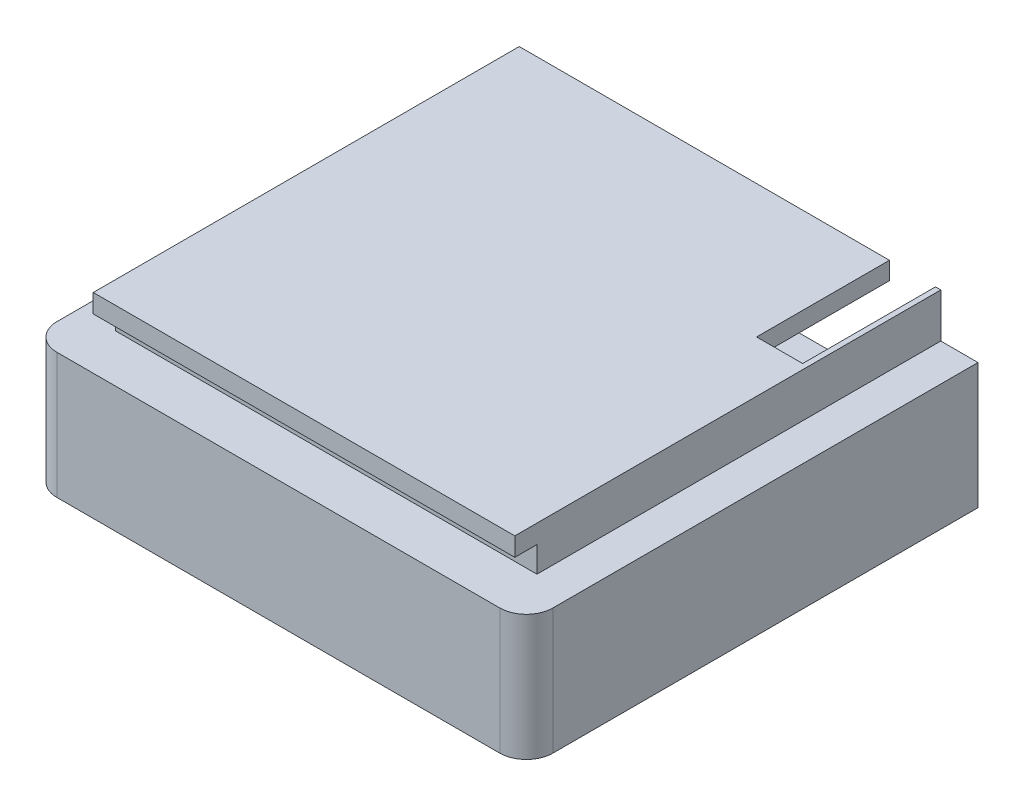
ISO-10303-21;
HEADER;
FILE_DESCRIPTION(('STEP AP214'),'2;1');
FILE_NAME('part.step','',(''),(''),'','','');
FILE_SCHEMA(('AUTOMOTIVE_DESIGN { 1 0 10303 214 1 1 1 1 }'));
ENDSEC;
DATA;
#1=APPLICATION_CONTEXT('core data for automotive mechanical design processes');
#2=APPLICATION_PROTOCOL_DEFINITION('international standard','automotive_design',2000,#1);
#3=PRODUCT_CONTEXT('',#1,'mechanical');
#4=PRODUCT('Part','Part','',(#3));
#5=PRODUCT_RELATED_PRODUCT_CATEGORY('part','',(#4));
#6=PRODUCT_DEFINITION_FORMATION('','',#4);
#7=PRODUCT_DEFINITION_CONTEXT('part definition',#1,'design');
#8=PRODUCT_DEFINITION('design','',#6,#7);
#9=PRODUCT_DEFINITION_SHAPE('','',#8);
#10=(LENGTH_UNIT() NAMED_UNIT(*) SI_UNIT(.MILLI.,.METRE.));
#11=(NAMED_UNIT(*) PLANE_ANGLE_UNIT() SI_UNIT($,.RADIAN.));
#12=(NAMED_UNIT(*) SI_UNIT($,.STERADIAN.) SOLID_ANGLE_UNIT());
#13=UNCERTAINTY_MEASURE_WITH_UNIT(LENGTH_MEASURE(1.E-05),#10,'distance_accuracy_value','');
#14=(GEOMETRIC_REPRESENTATION_CONTEXT(3) GLOBAL_UNCERTAINTY_ASSIGNED_CONTEXT((#13)) GLOBAL_UNIT_ASSIGNED_CONTEXT((#10,
#11,#12)) REPRESENTATION_CONTEXT('',''));
#15=CARTESIAN_POINT('',(0.,0.,0.));
#16=DIRECTION('',(0.,0.,1.));
#17=DIRECTION('',(1.,0.,0.));
#18=AXIS2_PLACEMENT_3D('',#15,#16,#17);
#19=CARTESIAN_POINT('',(0.,10.2,-51.));
#20=DIRECTION('',(0.,0.,1.));
#21=DIRECTION('',(1.,0.,0.));
#22=AXIS2_PLACEMENT_3D('',#19,#20,#21);
#23=PLANE('',#22);
#24=DIRECTION('',(1.,0.,0.));
#25=VECTOR('',#24,1.);
#26=CARTESIAN_POINT('',(56.,-7.,-51.));
#27=LINE('',#26,#25);
#28=CARTESIAN_POINT('',(51.2,-7.,-51.));
#29=VERTEX_POINT('',#28);
#30=CARTESIAN_POINT('',(56.,-7.,-51.));
#31=VERTEX_POINT('',#30);
#32=EDGE_CURVE('E260',#29,#31,#27,.T.);
#33=ORIENTED_EDGE('',*,*,#32,.F.);
#34=DIRECTION('',(0.,-1.,0.));
#35=VECTOR('',#34,1.);
#36=CARTESIAN_POINT('',(51.2,10.2,-51.));
#37=LINE('',#36,#35);
#38=CARTESIAN_POINT('',(51.2,12.2,-51.));
#39=VERTEX_POINT('',#38);
#40=EDGE_CURVE('E295',#39,#29,#37,.T.);
#41=ORIENTED_EDGE('',*,*,#40,.F.);
#42=DIRECTION('',(-1.,0.,0.));
#43=VECTOR('',#42,1.);
#44=CARTESIAN_POINT('',(0.,12.2,-51.));
#45=LINE('',#44,#43);
#46=CARTESIAN_POINT('',(51.8,12.2,-51.));
#47=VERTEX_POINT('',#46);
#48=EDGE_CURVE('E315',#47,#39,#45,.T.);
#49=ORIENTED_EDGE('',*,*,#48,.F.);
#50=DIRECTION('',(0.,1.,0.));
#51=VECTOR('',#50,1.);
#52=CARTESIAN_POINT('',(51.8,-43.9566222497146,-51.));
#53=LINE('',#52,#51);
#54=CARTESIAN_POINT('',(51.8,7.2,-51.));
#55=VERTEX_POINT('',#54);
#56=EDGE_CURVE('E379',#55,#47,#53,.T.);
#57=ORIENTED_EDGE('',*,*,#56,.F.);
#58=DIRECTION('',(-1.,0.,0.));
#59=VECTOR('',#58,1.);
#60=CARTESIAN_POINT('',(52.,7.2,-51.));
#61=LINE('',#60,#59);
#62=CARTESIAN_POINT('',(56.,7.2,-51.));
#63=VERTEX_POINT('',#62);
#64=EDGE_CURVE('E375',#63,#55,#61,.T.);
#65=ORIENTED_EDGE('',*,*,#64,.F.);
#66=DIRECTION('',(0.,-1.,0.));
#67=VECTOR('',#66,1.);
#68=CARTESIAN_POINT('',(56.,10.2,-51.));
#69=LINE('',#68,#67);
#70=EDGE_CURVE('E243',#63,#31,#69,.T.);
#71=ORIENTED_EDGE('',*,*,#70,.T.);
#72=EDGE_LOOP('',(#33,#41,#49,#57,#65,#71));
#73=FACE_BOUND('',#72,.T.);
#74=ADVANCED_FACE('F43',(#73),#23,.F.);
#75=CARTESIAN_POINT('',(46.,12.2,-51.));
#76=VERTEX_POINT('',#75);
#77=CARTESIAN_POINT('',(4.2,12.2,-51.));
#78=VERTEX_POINT('',#77);
#79=EDGE_CURVE('E393',#76,#78,#45,.T.);
#80=ORIENTED_EDGE('',*,*,#79,.F.);
#81=DIRECTION('',(0.,1.,0.));
#82=VECTOR('',#81,1.);
#83=CARTESIAN_POINT('',(46.,12.2,-51.));
#84=LINE('',#83,#82);
#85=CARTESIAN_POINT('',(46.,10.2,-51.));
#86=VERTEX_POINT('',#85);
#87=EDGE_CURVE('E565',#86,#76,#84,.T.);
#88=ORIENTED_EDGE('',*,*,#87,.F.);
#89=DIRECTION('',(-1.,0.,0.));
#90=VECTOR('',#89,1.);
#91=CARTESIAN_POINT('',(0.,10.2,-51.));
#92=LINE('',#91,#90);
#93=CARTESIAN_POINT('',(4.8,10.2,-51.));
#94=VERTEX_POINT('',#93);
#95=EDGE_CURVE('E394',#86,#94,#92,.T.);
#96=ORIENTED_EDGE('',*,*,#95,.T.);
#97=DIRECTION('',(0.,-1.,0.));
#98=VECTOR('',#97,1.);
#99=CARTESIAN_POINT('',(4.8,10.2,-51.));
#100=LINE('',#99,#98);
#101=CARTESIAN_POINT('',(4.8,-7.,-51.));
#102=VERTEX_POINT('',#101);
#103=EDGE_CURVE('E277',#94,#102,#100,.T.);
#104=ORIENTED_EDGE('',*,*,#103,.T.);
#105=DIRECTION('',(1.,0.,0.));
#106=VECTOR('',#105,1.);
#107=CARTESIAN_POINT('',(0.,-7.,-51.));
#108=LINE('',#107,#106);
#109=CARTESIAN_POINT('',(0.,-7.,-51.));
#110=VERTEX_POINT('',#109);
#111=EDGE_CURVE('E225',#110,#102,#108,.T.);
#112=ORIENTED_EDGE('',*,*,#111,.F.);
#113=DIRECTION('',(0.,-1.,0.));
#114=VECTOR('',#113,1.);
#115=CARTESIAN_POINT('',(0.,10.2,-51.));
#116=LINE('',#115,#114);
#117=CARTESIAN_POINT('',(0.,7.2,-51.));
#118=VERTEX_POINT('',#117);
#119=EDGE_CURVE('E282',#118,#110,#116,.T.);
#120=ORIENTED_EDGE('',*,*,#119,.F.);
#121=DIRECTION('',(-1.,0.,0.));
#122=VECTOR('',#121,1.);
#123=CARTESIAN_POINT('',(0.,7.2,-51.));
#124=LINE('',#123,#122);
#125=CARTESIAN_POINT('',(4.2,7.2,-51.));
#126=VERTEX_POINT('',#125);
#127=EDGE_CURVE('E370',#126,#118,#124,.T.);
#128=ORIENTED_EDGE('',*,*,#127,.F.);
#129=DIRECTION('',(0.,1.,0.));
#130=VECTOR('',#129,1.);
#131=CARTESIAN_POINT('',(4.2,10.2,-51.));
#132=LINE('',#131,#130);
#133=EDGE_CURVE('E374',#126,#78,#132,.T.);
#134=ORIENTED_EDGE('',*,*,#133,.T.);
#135=EDGE_LOOP('',(#80,#88,#96,#104,#112,#120,#128,#134));
#136=FACE_BOUND('',#135,.T.);
#137=ADVANCED_FACE('F516',(#136),#23,.F.);
#138=CARTESIAN_POINT('',(0.,-1.6,-107.035702904488));
#139=DIRECTION('',(0.,-1.,0.));
#140=DIRECTION('',(0.,0.,-1.));
#141=AXIS2_PLACEMENT_3D('',#138,#139,#140);
#142=PLANE('',#141);
#143=DIRECTION('',(0.,0.,-1.));
#144=VECTOR('',#143,1.);
#145=CARTESIAN_POINT('',(46.,-1.6,-107.035702904488));
#146=LINE('',#145,#144);
#147=CARTESIAN_POINT('',(46.,-1.6,-36.));
#148=VERTEX_POINT('',#147);
#149=CARTESIAN_POINT('',(46.,-1.6,-51.));
#150=VERTEX_POINT('',#149);
#151=EDGE_CURVE('E323',#148,#150,#146,.T.);
#152=ORIENTED_EDGE('',*,*,#151,.F.);
#153=DIRECTION('',(-1.,0.,0.));
#154=VECTOR('',#153,1.);
#155=CARTESIAN_POINT('',(0.,-1.6,-36.));
#156=LINE('',#155,#154);
#157=CARTESIAN_POINT('',(51.2,-1.6,-36.));
#158=VERTEX_POINT('',#157);
#159=EDGE_CURVE('E305',#158,#148,#156,.T.);
#160=ORIENTED_EDGE('',*,*,#159,.F.);
#161=DIRECTION('',(0.,0.,-1.));
#162=VECTOR('',#161,1.);
#163=CARTESIAN_POINT('',(51.2,-1.6,-6.99999999999998));
#164=LINE('',#163,#162);
#165=CARTESIAN_POINT('',(51.2,-1.6,-2.3));
#166=VERTEX_POINT('',#165);
#167=EDGE_CURVE('E255',#166,#158,#164,.T.);
#168=ORIENTED_EDGE('',*,*,#167,.F.);
#169=DIRECTION('',(1.,0.,0.));
#170=VECTOR('',#169,1.);
#171=CARTESIAN_POINT('',(0.,-1.6,-2.3));
#172=LINE('',#171,#170);
#173=CARTESIAN_POINT('',(4.8,-1.6,-2.3));
#174=VERTEX_POINT('',#173);
#175=EDGE_CURVE('E218',#174,#166,#172,.T.);
#176=ORIENTED_EDGE('',*,*,#175,.F.);
#177=DIRECTION('',(0.,0.,1.));
#178=VECTOR('',#177,1.);
#179=CARTESIAN_POINT('',(4.8,-1.6,-51.));
#180=LINE('',#179,#178);
#181=CARTESIAN_POINT('',(4.8,-1.6,-36.));
#182=VERTEX_POINT('',#181);
#183=EDGE_CURVE('E207',#182,#174,#180,.T.);
#184=ORIENTED_EDGE('',*,*,#183,.F.);
#185=DIRECTION('',(1.,0.,0.));
#186=VECTOR('',#185,1.);
#187=CARTESIAN_POINT('',(0.,-1.6,-36.));
#188=LINE('',#187,#186);
#189=CARTESIAN_POINT('',(10.,-1.6,-36.));
#190=VERTEX_POINT('',#189);
#191=EDGE_CURVE('E191',#182,#190,#188,.T.);
#192=ORIENTED_EDGE('',*,*,#191,.T.);
#193=DIRECTION('',(0.,0.,1.));
#194=VECTOR('',#193,1.);
#195=CARTESIAN_POINT('',(10.,-1.6,-107.035702904488));
#196=LINE('',#195,#194);
#197=CARTESIAN_POINT('',(10.,-1.6,-51.));
#198=VERTEX_POINT('',#197);
#199=EDGE_CURVE('E202',#198,#190,#196,.T.);
#200=ORIENTED_EDGE('',*,*,#199,.F.);
#201=DIRECTION('',(-1.,0.,0.));
#202=VECTOR('',#201,1.);
#203=CARTESIAN_POINT('',(0.,-1.6,-51.));
#204=LINE('',#203,#202);
#205=EDGE_CURVE('E327',#150,#198,#204,.T.);
#206=ORIENTED_EDGE('',*,*,#205,.F.);
#207=EDGE_LOOP('',(#152,#160,#168,#176,#184,#192,#200,#206));
#208=FACE_BOUND('',#207,.T.);
#209=ADVANCED_FACE('F45',(#208),#142,.T.);
#210=CARTESIAN_POINT('',(0.,0.,-2.3));
#211=DIRECTION('',(0.,0.,1.));
#212=DIRECTION('',(1.,0.,0.));
#213=AXIS2_PLACEMENT_3D('',#210,#211,#212);
#214=PLANE('',#213);
#215=DIRECTION('',(0.,1.,0.));
#216=VECTOR('',#215,1.);
#217=CARTESIAN_POINT('',(51.2,0.,-2.3));
#218=LINE('',#217,#216);
#219=CARTESIAN_POINT('',(51.2,-4.7,-2.3));
#220=VERTEX_POINT('',#219);
#221=EDGE_CURVE('E252',#220,#166,#218,.T.);
#222=ORIENTED_EDGE('',*,*,#221,.F.);
#223=DIRECTION('',(1.,0.,0.));
#224=VECTOR('',#223,1.);
#225=CARTESIAN_POINT('',(0.,-4.7,-2.3));
#226=LINE('',#225,#224);
#227=CARTESIAN_POINT('',(4.8,-4.7,-2.3));
#228=VERTEX_POINT('',#227);
#229=EDGE_CURVE('E261',#228,#220,#226,.T.);
#230=ORIENTED_EDGE('',*,*,#229,.F.);
#231=DIRECTION('',(0.,1.,0.));
#232=VECTOR('',#231,1.);
#233=CARTESIAN_POINT('',(4.8,10.2,-2.3));
#234=LINE('',#233,#232);
#235=EDGE_CURVE('E220',#228,#174,#234,.T.);
#236=ORIENTED_EDGE('',*,*,#235,.T.);
#237=ORIENTED_EDGE('',*,*,#175,.T.);
#238=EDGE_LOOP('',(#222,#230,#236,#237));
#239=FACE_BOUND('',#238,.T.);
#240=ADVANCED_FACE('F663',(#239),#214,.F.);
#241=CARTESIAN_POINT('',(0.,-4.7,-5.));
#242=DIRECTION('',(0.,-1.,0.));
#243=DIRECTION('',(0.,0.,-1.));
#244=AXIS2_PLACEMENT_3D('',#241,#242,#243);
#245=PLANE('',#244);
#246=DIRECTION('',(0.,0.,1.));
#247=VECTOR('',#246,1.);
#248=CARTESIAN_POINT('',(51.2,-4.7,-5.));
#249=LINE('',#248,#247);
#250=CARTESIAN_POINT('',(51.2,-4.7,-4.8));
#251=VERTEX_POINT('',#250);
#252=EDGE_CURVE('E221',#251,#220,#249,.T.);
#253=ORIENTED_EDGE('',*,*,#252,.F.);
#254=DIRECTION('',(1.,0.,0.));
#255=VECTOR('',#254,1.);
#256=CARTESIAN_POINT('',(0.,-4.7,-4.8));
#257=LINE('',#256,#255);
#258=CARTESIAN_POINT('',(4.8,-4.7,-4.8));
#259=VERTEX_POINT('',#258);
#260=EDGE_CURVE('E247',#259,#251,#257,.T.);
#261=ORIENTED_EDGE('',*,*,#260,.F.);
#262=DIRECTION('',(0.,0.,-1.));
#263=VECTOR('',#262,1.);
#264=CARTESIAN_POINT('',(4.8,-4.7,-5.));
#265=LINE('',#264,#263);
#266=EDGE_CURVE('E233',#228,#259,#265,.T.);
#267=ORIENTED_EDGE('',*,*,#266,.F.);
#268=ORIENTED_EDGE('',*,*,#229,.T.);
#269=EDGE_LOOP('',(#253,#261,#267,#268));
#270=FACE_BOUND('',#269,.T.);
#271=ADVANCED_FACE('F661',(#270),#245,.F.);
#272=CARTESIAN_POINT('',(0.,0.,-4.8));
#273=DIRECTION('',(0.,0.,1.));
#274=DIRECTION('',(1.,0.,0.));
#275=AXIS2_PLACEMENT_3D('',#272,#273,#274);
#276=PLANE('',#275);
#277=DIRECTION('',(0.,1.,0.));
#278=VECTOR('',#277,1.);
#279=CARTESIAN_POINT('',(51.2,0.,-4.8));
#280=LINE('',#279,#278);
#281=CARTESIAN_POINT('',(51.2,-7.,-4.8));
#282=VERTEX_POINT('',#281);
#283=EDGE_CURVE('E227',#282,#251,#280,.T.);
#284=ORIENTED_EDGE('',*,*,#283,.F.);
#285=DIRECTION('',(1.,0.,0.));
#286=VECTOR('',#285,1.);
#287=CARTESIAN_POINT('',(0.,-7.,-4.8));
#288=LINE('',#287,#286);
#289=CARTESIAN_POINT('',(4.8,-7.,-4.8));
#290=VERTEX_POINT('',#289);
#291=EDGE_CURVE('E250',#290,#282,#288,.T.);
#292=ORIENTED_EDGE('',*,*,#291,.F.);
#293=DIRECTION('',(0.,-1.,0.));
#294=VECTOR('',#293,1.);
#295=CARTESIAN_POINT('',(4.8,0.,-4.8));
#296=LINE('',#295,#294);
#297=EDGE_CURVE('E238',#259,#290,#296,.T.);
#298=ORIENTED_EDGE('',*,*,#297,.F.);
#299=ORIENTED_EDGE('',*,*,#260,.T.);
#300=EDGE_LOOP('',(#284,#292,#298,#299));
#301=FACE_BOUND('',#300,.T.);
#302=ADVANCED_FACE('F619',(#301),#276,.F.);
#303=CARTESIAN_POINT('',(0.,10.2,0.));
#304=DIRECTION('',(1.,0.,0.));
#305=DIRECTION('',(0.,0.,-1.));
#306=AXIS2_PLACEMENT_3D('',#303,#304,#305);
#307=PLANE('',#306);
#308=DIRECTION('',(0.,0.,1.));
#309=VECTOR('',#308,1.);
#310=CARTESIAN_POINT('',(0.,-7.,-5.));
#311=LINE('',#310,#309);
#312=CARTESIAN_POINT('',(0.,-7.,-3.));
#313=VERTEX_POINT('',#312);
#314=EDGE_CURVE('E291',#110,#313,#311,.T.);
#315=ORIENTED_EDGE('',*,*,#314,.T.);
#316=DIRECTION('',(0.,-1.,0.));
#317=VECTOR('',#316,1.);
#318=CARTESIAN_POINT('',(0.,10.2,-3.));
#319=LINE('',#318,#317);
#320=CARTESIAN_POINT('',(0.,7.2,-3.));
#321=VERTEX_POINT('',#320);
#322=EDGE_CURVE('E13',#313,#321,#319,.F.);
#323=ORIENTED_EDGE('',*,*,#322,.T.);
#324=DIRECTION('',(0.,0.,1.));
#325=VECTOR('',#324,1.);
#326=CARTESIAN_POINT('',(0.,7.2,-51.));
#327=LINE('',#326,#325);
#328=EDGE_CURVE('E366',#118,#321,#327,.T.);
#329=ORIENTED_EDGE('',*,*,#328,.F.);
#330=ORIENTED_EDGE('',*,*,#119,.T.);
#331=EDGE_LOOP('',(#315,#323,#329,#330));
#332=FACE_BOUND('',#331,.T.);
#333=ADVANCED_FACE('F512',(#332),#307,.F.);
#334=CARTESIAN_POINT('',(0.,10.2,0.));
#335=DIRECTION('',(0.,0.,-1.));
#336=DIRECTION('',(-1.,0.,0.));
#337=AXIS2_PLACEMENT_3D('',#334,#335,#336);
#338=PLANE('',#337);
#339=DIRECTION('',(1.,0.,0.));
#340=VECTOR('',#339,1.);
#341=CARTESIAN_POINT('',(0.,-7.,0.));
#342=LINE('',#341,#340);
#343=CARTESIAN_POINT('',(3.,-7.,0.));
#344=VERTEX_POINT('',#343);
#345=CARTESIAN_POINT('',(53.,-7.,0.));
#346=VERTEX_POINT('',#345);
#347=EDGE_CURVE('E236',#344,#346,#342,.T.);
#348=ORIENTED_EDGE('',*,*,#347,.T.);
#349=DIRECTION('',(0.,-1.,0.));
#350=VECTOR('',#349,1.);
#351=CARTESIAN_POINT('',(53.,10.2,0.));
#352=LINE('',#351,#350);
#353=CARTESIAN_POINT('',(53.,7.2,0.));
#354=VERTEX_POINT('',#353);
#355=EDGE_CURVE('E432',#346,#354,#352,.F.);
#356=ORIENTED_EDGE('',*,*,#355,.T.);
#357=DIRECTION('',(-1.,0.,0.));
#358=VECTOR('',#357,1.);
#359=CARTESIAN_POINT('',(63.0710678118655,7.2,0.));
#360=LINE('',#359,#358);
#361=CARTESIAN_POINT('',(3.,7.2,0.));
#362=VERTEX_POINT('',#361);
#363=EDGE_CURVE('E384',#354,#362,#360,.T.);
#364=ORIENTED_EDGE('',*,*,#363,.T.);
#365=DIRECTION('',(0.,-1.,0.));
#366=VECTOR('',#365,1.);
#367=CARTESIAN_POINT('',(3.,10.2,0.));
#368=LINE('',#367,#366);
#369=EDGE_CURVE('E428',#362,#344,#368,.T.);
#370=ORIENTED_EDGE('',*,*,#369,.T.);
#371=EDGE_LOOP('',(#348,#356,#364,#370));
#372=FACE_BOUND('',#371,.T.);
#373=ADVANCED_FACE('F533',(#372),#338,.F.);
#374=CARTESIAN_POINT('',(56.,10.2,0.));
#375=DIRECTION('',(-1.,0.,0.));
#376=DIRECTION('',(0.,0.,1.));
#377=AXIS2_PLACEMENT_3D('',#374,#375,#376);
#378=PLANE('',#377);
#379=DIRECTION('',(0.,0.,-1.));
#380=VECTOR('',#379,1.);
#381=CARTESIAN_POINT('',(56.,7.2,0.));
#382=LINE('',#381,#380);
#383=CARTESIAN_POINT('',(56.,7.2,-3.));
#384=VERTEX_POINT('',#383);
#385=EDGE_CURVE('E380',#384,#63,#382,.T.);
#386=ORIENTED_EDGE('',*,*,#385,.F.);
#387=DIRECTION('',(0.,-1.,0.));
#388=VECTOR('',#387,1.);
#389=CARTESIAN_POINT('',(56.,10.2,-3.));
#390=LINE('',#389,#388);
#391=CARTESIAN_POINT('',(56.,-7.,-3.));
#392=VERTEX_POINT('',#391);
#393=EDGE_CURVE('E416',#384,#392,#390,.T.);
#394=ORIENTED_EDGE('',*,*,#393,.T.);
#395=DIRECTION('',(0.,0.,1.));
#396=VECTOR('',#395,1.);
#397=CARTESIAN_POINT('',(56.,-7.,-5.));
#398=LINE('',#397,#396);
#399=EDGE_CURVE('E268',#31,#392,#398,.T.);
#400=ORIENTED_EDGE('',*,*,#399,.F.);
#401=ORIENTED_EDGE('',*,*,#70,.F.);
#402=EDGE_LOOP('',(#386,#394,#400,#401));
#403=FACE_BOUND('',#402,.T.);
#404=ADVANCED_FACE('F626',(#403),#378,.F.);
#405=CARTESIAN_POINT('',(51.2,10.2,-6.99999999999998));
#406=DIRECTION('',(1.,0.,0.));
#407=DIRECTION('',(0.,0.,-1.));
#408=AXIS2_PLACEMENT_3D('',#405,#406,#407);
#409=PLANE('',#408);
#410=ORIENTED_EDGE('',*,*,#40,.T.);
#411=DIRECTION('',(0.,0.,-1.));
#412=VECTOR('',#411,1.);
#413=CARTESIAN_POINT('',(51.2,-7.,-6.99999999999998));
#414=LINE('',#413,#412);
#415=EDGE_CURVE('E246',#282,#29,#414,.T.);
#416=ORIENTED_EDGE('',*,*,#415,.F.);
#417=ORIENTED_EDGE('',*,*,#283,.T.);
#418=ORIENTED_EDGE('',*,*,#252,.T.);
#419=ORIENTED_EDGE('',*,*,#221,.T.);
#420=ORIENTED_EDGE('',*,*,#167,.T.);
#421=DIRECTION('',(0.,-1.,0.));
#422=VECTOR('',#421,1.);
#423=CARTESIAN_POINT('',(51.2,0.,-36.));
#424=LINE('',#423,#422);
#425=CARTESIAN_POINT('',(51.2,0.,-36.));
#426=VERTEX_POINT('',#425);
#427=EDGE_CURVE('E306',#426,#158,#424,.T.);
#428=ORIENTED_EDGE('',*,*,#427,.F.);
#429=DIRECTION('',(0.,0.,1.));
#430=VECTOR('',#429,1.);
#431=CARTESIAN_POINT('',(51.2,0.,-107.035702904488));
#432=LINE('',#431,#430);
#433=CARTESIAN_POINT('',(51.2,0.,-6.99999999999998));
#434=VERTEX_POINT('',#433);
#435=EDGE_CURVE('E312',#426,#434,#432,.T.);
#436=ORIENTED_EDGE('',*,*,#435,.T.);
#437=DIRECTION('',(0.,-1.,0.));
#438=VECTOR('',#437,1.);
#439=CARTESIAN_POINT('',(51.2,10.2,-6.99999999999998));
#440=LINE('',#439,#438);
#441=CARTESIAN_POINT('',(51.2,10.2,-6.99999999999998));
#442=VERTEX_POINT('',#441);
#443=EDGE_CURVE('E276',#442,#434,#440,.T.);
#444=ORIENTED_EDGE('',*,*,#443,.F.);
#445=DIRECTION('',(0.,0.,1.));
#446=VECTOR('',#445,1.);
#447=CARTESIAN_POINT('',(51.2,10.2,-6.99999999999998));
#448=LINE('',#447,#446);
#449=CARTESIAN_POINT('',(51.2,10.2,-36.));
#450=VERTEX_POINT('',#449);
#451=EDGE_CURVE('E271',#450,#442,#448,.T.);
#452=ORIENTED_EDGE('',*,*,#451,.F.);
#453=DIRECTION('',(0.,-1.,0.));
#454=VECTOR('',#453,1.);
#455=CARTESIAN_POINT('',(51.2,0.,-36.));
#456=LINE('',#455,#454);
#457=CARTESIAN_POINT('',(51.2,12.2,-36.));
#458=VERTEX_POINT('',#457);
#459=EDGE_CURVE('E302',#458,#450,#456,.T.);
#460=ORIENTED_EDGE('',*,*,#459,.F.);
#461=DIRECTION('',(0.,0.,-1.));
#462=VECTOR('',#461,1.);
#463=CARTESIAN_POINT('',(51.2,12.2,0.));
#464=LINE('',#463,#462);
#465=EDGE_CURVE('E203',#458,#39,#464,.T.);
#466=ORIENTED_EDGE('',*,*,#465,.T.);
#467=EDGE_LOOP('',(#410,#416,#417,#418,#419,#420,#428,#436,#444,#452,#460,#466));
#468=FACE_BOUND('',#467,.T.);
#469=ADVANCED_FACE('F606',(#468),#409,.F.);
#470=CARTESIAN_POINT('',(5.00000000000001,10.2,-6.99999999999999));
#471=DIRECTION('',(0.,0.,1.));
#472=DIRECTION('',(1.,0.,0.));
#473=AXIS2_PLACEMENT_3D('',#470,#471,#472);
#474=PLANE('',#473);
#475=DIRECTION('',(-1.,0.,0.));
#476=VECTOR('',#475,1.);
#477=CARTESIAN_POINT('',(5.00000000000001,0.,-6.99999999999999));
#478=LINE('',#477,#476);
#479=CARTESIAN_POINT('',(4.8,0.,-6.99999999999999));
#480=VERTEX_POINT('',#479);
#481=EDGE_CURVE('E272',#434,#480,#478,.T.);
#482=ORIENTED_EDGE('',*,*,#481,.T.);
#483=DIRECTION('',(0.,-1.,0.));
#484=VECTOR('',#483,1.);
#485=CARTESIAN_POINT('',(4.8,10.2,-6.99999999999999));
#486=LINE('',#485,#484);
#487=CARTESIAN_POINT('',(4.8,10.2,-6.99999999999999));
#488=VERTEX_POINT('',#487);
#489=EDGE_CURVE('E273',#488,#480,#486,.T.);
#490=ORIENTED_EDGE('',*,*,#489,.F.);
#491=DIRECTION('',(-1.,0.,0.));
#492=VECTOR('',#491,1.);
#493=CARTESIAN_POINT('',(5.00000000000001,10.2,-6.99999999999999));
#494=LINE('',#493,#492);
#495=EDGE_CURVE('E283',#442,#488,#494,.T.);
#496=ORIENTED_EDGE('',*,*,#495,.F.);
#497=ORIENTED_EDGE('',*,*,#443,.T.);
#498=EDGE_LOOP('',(#482,#490,#496,#497));
#499=FACE_BOUND('',#498,.T.);
#500=ADVANCED_FACE('F634',(#499),#474,.F.);
#501=CARTESIAN_POINT('',(4.8,10.2,-51.));
#502=DIRECTION('',(-1.,0.,0.));
#503=DIRECTION('',(0.,0.,1.));
#504=AXIS2_PLACEMENT_3D('',#501,#502,#503);
#505=PLANE('',#504);
#506=DIRECTION('',(0.,0.,-1.));
#507=VECTOR('',#506,1.);
#508=CARTESIAN_POINT('',(4.8,0.,-107.035702904488));
#509=LINE('',#508,#507);
#510=CARTESIAN_POINT('',(4.8,0.,-36.));
#511=VERTEX_POINT('',#510);
#512=EDGE_CURVE('E210',#480,#511,#509,.T.);
#513=ORIENTED_EDGE('',*,*,#512,.T.);
#514=DIRECTION('',(0.,1.,0.));
#515=VECTOR('',#514,1.);
#516=CARTESIAN_POINT('',(4.8,0.,-36.));
#517=LINE('',#516,#515);
#518=EDGE_CURVE('E47',#182,#511,#517,.T.);
#519=ORIENTED_EDGE('',*,*,#518,.F.);
#520=ORIENTED_EDGE('',*,*,#183,.T.);
#521=ORIENTED_EDGE('',*,*,#235,.F.);
#522=ORIENTED_EDGE('',*,*,#266,.T.);
#523=ORIENTED_EDGE('',*,*,#297,.T.);
#524=DIRECTION('',(0.,0.,1.));
#525=VECTOR('',#524,1.);
#526=CARTESIAN_POINT('',(4.8,-7.,-51.));
#527=LINE('',#526,#525);
#528=EDGE_CURVE('E237',#102,#290,#527,.T.);
#529=ORIENTED_EDGE('',*,*,#528,.F.);
#530=ORIENTED_EDGE('',*,*,#103,.F.);
#531=DIRECTION('',(0.,0.,-1.));
#532=VECTOR('',#531,1.);
#533=CARTESIAN_POINT('',(4.8,10.2,-51.));
#534=LINE('',#533,#532);
#535=EDGE_CURVE('E278',#488,#94,#534,.T.);
#536=ORIENTED_EDGE('',*,*,#535,.F.);
#537=ORIENTED_EDGE('',*,*,#489,.T.);
#538=EDGE_LOOP('',(#513,#519,#520,#521,#522,#523,#529,#530,#536,#537));
#539=FACE_BOUND('',#538,.T.);
#540=ADVANCED_FACE('F206',(#539),#505,.F.);
#541=DIRECTION('',(-1.,0.,0.));
#542=VECTOR('',#541,1.);
#543=CARTESIAN_POINT('',(0.,0.,-51.));
#544=LINE('',#543,#542);
#545=CARTESIAN_POINT('',(46.,0.,-51.));
#546=VERTEX_POINT('',#545);
#547=CARTESIAN_POINT('',(10.,0.,-51.));
#548=VERTEX_POINT('',#547);
#549=EDGE_CURVE('E265',#546,#548,#544,.T.);
#550=ORIENTED_EDGE('',*,*,#549,.F.);
#551=EDGE_CURVE('E318',#150,#546,#84,.T.);
#552=ORIENTED_EDGE('',*,*,#551,.F.);
#553=ORIENTED_EDGE('',*,*,#205,.T.);
#554=DIRECTION('',(0.,-1.,0.));
#555=VECTOR('',#554,1.);
#556=CARTESIAN_POINT('',(10.,-7.,-51.));
#557=LINE('',#556,#555);
#558=EDGE_CURVE('E213',#548,#198,#557,.T.);
#559=ORIENTED_EDGE('',*,*,#558,.F.);
#560=EDGE_LOOP('',(#550,#552,#553,#559));
#561=FACE_BOUND('',#560,.T.);
#562=ADVANCED_FACE('F593',(#561),#23,.F.);
#563=CARTESIAN_POINT('',(0.,10.2,0.));
#564=DIRECTION('',(0.,1.,0.));
#565=DIRECTION('',(0.,0.,1.));
#566=AXIS2_PLACEMENT_3D('',#563,#564,#565);
#567=PLANE('',#566);
#568=ORIENTED_EDGE('',*,*,#95,.F.);
#569=DIRECTION('',(0.,0.,1.));
#570=VECTOR('',#569,1.);
#571=CARTESIAN_POINT('',(46.,10.2,0.));
#572=LINE('',#571,#570);
#573=CARTESIAN_POINT('',(46.,10.2,-36.));
#574=VERTEX_POINT('',#573);
#575=EDGE_CURVE('E256',#86,#574,#572,.T.);
#576=ORIENTED_EDGE('',*,*,#575,.T.);
#577=DIRECTION('',(-1.,0.,0.));
#578=VECTOR('',#577,1.);
#579=CARTESIAN_POINT('',(0.,10.2,-36.));
#580=LINE('',#579,#578);
#581=EDGE_CURVE('E333',#450,#574,#580,.T.);
#582=ORIENTED_EDGE('',*,*,#581,.F.);
#583=ORIENTED_EDGE('',*,*,#451,.T.);
#584=ORIENTED_EDGE('',*,*,#495,.T.);
#585=ORIENTED_EDGE('',*,*,#535,.T.);
#586=EDGE_LOOP('',(#568,#576,#582,#583,#584,#585));
#587=FACE_BOUND('',#586,.T.);
#588=ADVANCED_FACE('F611',(#587),#567,.F.);
#589=CARTESIAN_POINT('',(0.,12.2,0.));
#590=DIRECTION('',(0.,1.,0.));
#591=DIRECTION('',(0.,0.,1.));
#592=AXIS2_PLACEMENT_3D('',#589,#590,#591);
#593=PLANE('',#592);
#594=ORIENTED_EDGE('',*,*,#465,.F.);
#595=DIRECTION('',(1.,0.,0.));
#596=VECTOR('',#595,1.);
#597=CARTESIAN_POINT('',(51.,12.2,-36.));
#598=LINE('',#597,#596);
#599=CARTESIAN_POINT('',(46.,12.2,-36.));
#600=VERTEX_POINT('',#599);
#601=EDGE_CURVE('E326',#600,#458,#598,.T.);
#602=ORIENTED_EDGE('',*,*,#601,.F.);
#603=DIRECTION('',(0.,0.,-1.));
#604=VECTOR('',#603,1.);
#605=CARTESIAN_POINT('',(46.,12.2,-36.));
#606=LINE('',#605,#604);
#607=EDGE_CURVE('E301',#600,#76,#606,.T.);
#608=ORIENTED_EDGE('',*,*,#607,.T.);
#609=ORIENTED_EDGE('',*,*,#79,.T.);
#610=DIRECTION('',(0.,0.,-1.));
#611=VECTOR('',#610,1.);
#612=CARTESIAN_POINT('',(4.2,12.2,0.));
#613=LINE('',#612,#611);
#614=CARTESIAN_POINT('',(4.2,12.2,-2.9));
#615=VERTEX_POINT('',#614);
#616=EDGE_CURVE('E478',#615,#78,#613,.T.);
#617=ORIENTED_EDGE('',*,*,#616,.F.);
#618=DIRECTION('',(-1.,0.,0.));
#619=VECTOR('',#618,1.);
#620=CARTESIAN_POINT('',(0.,12.2,-2.9));
#621=LINE('',#620,#619);
#622=CARTESIAN_POINT('',(51.8,12.2,-2.9));
#623=VERTEX_POINT('',#622);
#624=EDGE_CURVE('E451',#623,#615,#621,.T.);
#625=ORIENTED_EDGE('',*,*,#624,.F.);
#626=DIRECTION('',(0.,0.,1.));
#627=VECTOR('',#626,1.);
#628=CARTESIAN_POINT('',(51.8,12.2,0.));
#629=LINE('',#628,#627);
#630=EDGE_CURVE('E331',#47,#623,#629,.T.);
#631=ORIENTED_EDGE('',*,*,#630,.F.);
#632=ORIENTED_EDGE('',*,*,#48,.T.);
#633=EDGE_LOOP('',(#594,#602,#608,#609,#617,#625,#631,#632));
#634=FACE_BOUND('',#633,.T.);
#635=ADVANCED_FACE('F574',(#634),#593,.T.);
#636=CARTESIAN_POINT('',(63.0710678118655,7.2,-5.));
#637=DIRECTION('',(0.,-1.,0.));
#638=DIRECTION('',(0.,0.,-1.));
#639=AXIS2_PLACEMENT_3D('',#636,#637,#638);
#640=PLANE('',#639);
#641=ORIENTED_EDGE('',*,*,#363,.F.);
#642=CARTESIAN_POINT('',(53.,7.2,-3.));
#643=DIRECTION('',(0.,-1.,0.));
#644=DIRECTION('',(0.,0.,-1.));
#645=AXIS2_PLACEMENT_3D('',#642,#643,#644);
#646=CIRCLE('',#645,3.);
#647=EDGE_CURVE('E54',#354,#384,#646,.F.);
#648=ORIENTED_EDGE('',*,*,#647,.T.);
#649=ORIENTED_EDGE('',*,*,#385,.T.);
#650=ORIENTED_EDGE('',*,*,#64,.T.);
#651=DIRECTION('',(0.,0.,1.));
#652=VECTOR('',#651,1.);
#653=CARTESIAN_POINT('',(51.8,7.2,0.));
#654=LINE('',#653,#652);
#655=CARTESIAN_POINT('',(51.8,7.2,-5.4));
#656=VERTEX_POINT('',#655);
#657=EDGE_CURVE('E230',#55,#656,#654,.T.);
#658=ORIENTED_EDGE('',*,*,#657,.T.);
#659=DIRECTION('',(-1.,0.,0.));
#660=VECTOR('',#659,1.);
#661=CARTESIAN_POINT('',(63.0710678118655,7.2,-5.4));
#662=LINE('',#661,#660);
#663=CARTESIAN_POINT('',(4.2,7.2,-5.4));
#664=VERTEX_POINT('',#663);
#665=EDGE_CURVE('E389',#656,#664,#662,.T.);
#666=ORIENTED_EDGE('',*,*,#665,.T.);
#667=DIRECTION('',(0.,0.,-1.));
#668=VECTOR('',#667,1.);
#669=CARTESIAN_POINT('',(4.2,7.2,-51.));
#670=LINE('',#669,#668);
#671=EDGE_CURVE('E475',#664,#126,#670,.T.);
#672=ORIENTED_EDGE('',*,*,#671,.T.);
#673=ORIENTED_EDGE('',*,*,#127,.T.);
#674=ORIENTED_EDGE('',*,*,#328,.T.);
#675=CARTESIAN_POINT('',(3.,7.2,-3.));
#676=DIRECTION('',(0.,-1.,0.));
#677=DIRECTION('',(0.,0.,-1.));
#678=AXIS2_PLACEMENT_3D('',#675,#676,#677);
#679=CIRCLE('',#678,3.);
#680=EDGE_CURVE('E436',#321,#362,#679,.F.);
#681=ORIENTED_EDGE('',*,*,#680,.T.);
#682=EDGE_LOOP('',(#641,#648,#649,#650,#658,#666,#672,#673,#674,#681));
#683=FACE_BOUND('',#682,.T.);
#684=ADVANCED_FACE('F497',(#683),#640,.F.);
#685=CARTESIAN_POINT('',(63.0710678118655,9.7,-5.4));
#686=DIRECTION('',(0.,0.,-1.));
#687=DIRECTION('',(-1.,0.,0.));
#688=AXIS2_PLACEMENT_3D('',#685,#686,#687);
#689=PLANE('',#688);
#690=DIRECTION('',(0.,1.,0.));
#691=VECTOR('',#690,1.);
#692=CARTESIAN_POINT('',(51.8,9.7,-5.4));
#693=LINE('',#692,#691);
#694=CARTESIAN_POINT('',(51.8,10.1,-5.4));
#695=VERTEX_POINT('',#694);
#696=EDGE_CURVE('E397',#656,#695,#693,.T.);
#697=ORIENTED_EDGE('',*,*,#696,.T.);
#698=DIRECTION('',(-1.,0.,0.));
#699=VECTOR('',#698,1.);
#700=CARTESIAN_POINT('',(63.0710678118655,10.1,-5.4));
#701=LINE('',#700,#699);
#702=CARTESIAN_POINT('',(4.2,10.1,-5.4));
#703=VERTEX_POINT('',#702);
#704=EDGE_CURVE('E450',#695,#703,#701,.T.);
#705=ORIENTED_EDGE('',*,*,#704,.T.);
#706=DIRECTION('',(0.,-1.,0.));
#707=VECTOR('',#706,1.);
#708=CARTESIAN_POINT('',(4.2,9.7,-5.4));
#709=LINE('',#708,#707);
#710=EDGE_CURVE('E456',#703,#664,#709,.T.);
#711=ORIENTED_EDGE('',*,*,#710,.T.);
#712=ORIENTED_EDGE('',*,*,#665,.F.);
#713=EDGE_LOOP('',(#697,#705,#711,#712));
#714=FACE_BOUND('',#713,.T.);
#715=ADVANCED_FACE('F503',(#714),#689,.F.);
#716=CARTESIAN_POINT('',(63.0710678118655,10.1,-2.5));
#717=DIRECTION('',(0.,1.,0.));
#718=DIRECTION('',(0.,0.,1.));
#719=AXIS2_PLACEMENT_3D('',#716,#717,#718);
#720=PLANE('',#719);
#721=DIRECTION('',(0.,0.,1.));
#722=VECTOR('',#721,1.);
#723=CARTESIAN_POINT('',(51.8,10.1,-2.5));
#724=LINE('',#723,#722);
#725=CARTESIAN_POINT('',(51.8,10.1,-2.9));
#726=VERTEX_POINT('',#725);
#727=EDGE_CURVE('E442',#695,#726,#724,.T.);
#728=ORIENTED_EDGE('',*,*,#727,.T.);
#729=DIRECTION('',(-1.,0.,0.));
#730=VECTOR('',#729,1.);
#731=CARTESIAN_POINT('',(63.0710678118655,10.1,-2.9));
#732=LINE('',#731,#730);
#733=CARTESIAN_POINT('',(4.2,10.1,-2.9));
#734=VERTEX_POINT('',#733);
#735=EDGE_CURVE('E446',#726,#734,#732,.T.);
#736=ORIENTED_EDGE('',*,*,#735,.T.);
#737=DIRECTION('',(0.,0.,-1.));
#738=VECTOR('',#737,1.);
#739=CARTESIAN_POINT('',(4.2,10.1,-2.5));
#740=LINE('',#739,#738);
#741=EDGE_CURVE('E452',#734,#703,#740,.T.);
#742=ORIENTED_EDGE('',*,*,#741,.T.);
#743=ORIENTED_EDGE('',*,*,#704,.F.);
#744=EDGE_LOOP('',(#728,#736,#742,#743));
#745=FACE_BOUND('',#744,.T.);
#746=ADVANCED_FACE('F770',(#745),#720,.F.);
#747=CARTESIAN_POINT('',(63.0710678118655,12.2,-2.9));
#748=DIRECTION('',(0.,0.,-1.));
#749=DIRECTION('',(-1.,0.,0.));
#750=AXIS2_PLACEMENT_3D('',#747,#748,#749);
#751=PLANE('',#750);
#752=DIRECTION('',(0.,1.,0.));
#753=VECTOR('',#752,1.);
#754=CARTESIAN_POINT('',(51.8,12.2,-2.9));
#755=LINE('',#754,#753);
#756=EDGE_CURVE('E388',#726,#623,#755,.T.);
#757=ORIENTED_EDGE('',*,*,#756,.T.);
#758=ORIENTED_EDGE('',*,*,#624,.T.);
#759=DIRECTION('',(0.,-1.,0.));
#760=VECTOR('',#759,1.);
#761=CARTESIAN_POINT('',(4.2,12.2,-2.9));
#762=LINE('',#761,#760);
#763=EDGE_CURVE('E369',#615,#734,#762,.T.);
#764=ORIENTED_EDGE('',*,*,#763,.T.);
#765=ORIENTED_EDGE('',*,*,#735,.F.);
#766=EDGE_LOOP('',(#757,#758,#764,#765));
#767=FACE_BOUND('',#766,.T.);
#768=ADVANCED_FACE('F777',(#767),#751,.F.);
#769=CARTESIAN_POINT('',(51.8,-43.9566222497146,0.));
#770=DIRECTION('',(-1.,0.,0.));
#771=DIRECTION('',(0.,0.,1.));
#772=AXIS2_PLACEMENT_3D('',#769,#770,#771);
#773=PLANE('',#772);
#774=ORIENTED_EDGE('',*,*,#657,.F.);
#775=ORIENTED_EDGE('',*,*,#56,.T.);
#776=ORIENTED_EDGE('',*,*,#630,.T.);
#777=ORIENTED_EDGE('',*,*,#756,.F.);
#778=ORIENTED_EDGE('',*,*,#727,.F.);
#779=ORIENTED_EDGE('',*,*,#696,.F.);
#780=EDGE_LOOP('',(#774,#775,#776,#777,#778,#779));
#781=FACE_BOUND('',#780,.T.);
#782=ADVANCED_FACE('F500',(#781),#773,.F.);
#783=CARTESIAN_POINT('',(4.2,-43.9566222497146,-51.));
#784=DIRECTION('',(1.,0.,0.));
#785=DIRECTION('',(0.,0.,-1.));
#786=AXIS2_PLACEMENT_3D('',#783,#784,#785);
#787=PLANE('',#786);
#788=ORIENTED_EDGE('',*,*,#741,.F.);
#789=ORIENTED_EDGE('',*,*,#763,.F.);
#790=ORIENTED_EDGE('',*,*,#616,.T.);
#791=ORIENTED_EDGE('',*,*,#133,.F.);
#792=ORIENTED_EDGE('',*,*,#671,.F.);
#793=ORIENTED_EDGE('',*,*,#710,.F.);
#794=EDGE_LOOP('',(#788,#789,#790,#791,#792,#793));
#795=FACE_BOUND('',#794,.T.);
#796=ADVANCED_FACE('F505',(#795),#787,.F.);
#797=CARTESIAN_POINT('',(0.,0.,-107.035702904488));
#798=DIRECTION('',(0.,-1.,0.));
#799=DIRECTION('',(0.,0.,-1.));
#800=AXIS2_PLACEMENT_3D('',#797,#798,#799);
#801=PLANE('',#800);
#802=DIRECTION('',(1.,0.,0.));
#803=VECTOR('',#802,1.);
#804=CARTESIAN_POINT('',(0.,0.,-36.));
#805=LINE('',#804,#803);
#806=CARTESIAN_POINT('',(46.,0.,-36.));
#807=VERTEX_POINT('',#806);
#808=EDGE_CURVE('E242',#807,#426,#805,.T.);
#809=ORIENTED_EDGE('',*,*,#808,.F.);
#810=DIRECTION('',(0.,0.,-1.));
#811=VECTOR('',#810,1.);
#812=CARTESIAN_POINT('',(46.,0.,-107.035702904488));
#813=LINE('',#812,#811);
#814=EDGE_CURVE('E412',#807,#546,#813,.T.);
#815=ORIENTED_EDGE('',*,*,#814,.T.);
#816=ORIENTED_EDGE('',*,*,#549,.T.);
#817=DIRECTION('',(0.,0.,-1.));
#818=VECTOR('',#817,1.);
#819=CARTESIAN_POINT('',(10.,0.,-36.));
#820=LINE('',#819,#818);
#821=CARTESIAN_POINT('',(10.,0.,-36.));
#822=VERTEX_POINT('',#821);
#823=EDGE_CURVE('E346',#822,#548,#820,.T.);
#824=ORIENTED_EDGE('',*,*,#823,.F.);
#825=DIRECTION('',(1.,0.,0.));
#826=VECTOR('',#825,1.);
#827=CARTESIAN_POINT('',(5.00000000000001,0.,-36.));
#828=LINE('',#827,#826);
#829=EDGE_CURVE('E212',#511,#822,#828,.T.);
#830=ORIENTED_EDGE('',*,*,#829,.F.);
#831=ORIENTED_EDGE('',*,*,#512,.F.);
#832=ORIENTED_EDGE('',*,*,#481,.F.);
#833=ORIENTED_EDGE('',*,*,#435,.F.);
#834=EDGE_LOOP('',(#809,#815,#816,#824,#830,#831,#832,#833));
#835=FACE_BOUND('',#834,.T.);
#836=ADVANCED_FACE('F681',(#835),#801,.F.);
#837=CARTESIAN_POINT('',(0.,-7.,-5.));
#838=DIRECTION('',(0.,-1.,0.));
#839=DIRECTION('',(0.,0.,-1.));
#840=AXIS2_PLACEMENT_3D('',#837,#838,#839);
#841=PLANE('',#840);
#842=ORIENTED_EDGE('',*,*,#399,.T.);
#843=CARTESIAN_POINT('',(53.,-7.,-3.));
#844=DIRECTION('',(0.,-1.,0.));
#845=DIRECTION('',(0.,0.,-1.));
#846=AXIS2_PLACEMENT_3D('',#843,#844,#845);
#847=CIRCLE('',#846,3.);
#848=EDGE_CURVE('E424',#392,#346,#847,.T.);
#849=ORIENTED_EDGE('',*,*,#848,.T.);
#850=ORIENTED_EDGE('',*,*,#347,.F.);
#851=CARTESIAN_POINT('',(3.,-7.,-3.));
#852=DIRECTION('',(0.,-1.,0.));
#853=DIRECTION('',(0.,0.,-1.));
#854=AXIS2_PLACEMENT_3D('',#851,#852,#853);
#855=CIRCLE('',#854,3.);
#856=EDGE_CURVE('E420',#344,#313,#855,.T.);
#857=ORIENTED_EDGE('',*,*,#856,.T.);
#858=ORIENTED_EDGE('',*,*,#314,.F.);
#859=ORIENTED_EDGE('',*,*,#111,.T.);
#860=ORIENTED_EDGE('',*,*,#528,.T.);
#861=ORIENTED_EDGE('',*,*,#291,.T.);
#862=ORIENTED_EDGE('',*,*,#415,.T.);
#863=ORIENTED_EDGE('',*,*,#32,.T.);
#864=EDGE_LOOP('',(#842,#849,#850,#857,#858,#859,#860,#861,#862,#863));
#865=FACE_BOUND('',#864,.T.);
#866=ADVANCED_FACE('F521',(#865),#841,.T.);
#867=CARTESIAN_POINT('',(0.,0.,-36.));
#868=DIRECTION('',(0.,0.,-1.));
#869=DIRECTION('',(-1.,0.,0.));
#870=AXIS2_PLACEMENT_3D('',#867,#868,#869);
#871=PLANE('',#870);
#872=ORIENTED_EDGE('',*,*,#808,.T.);
#873=ORIENTED_EDGE('',*,*,#427,.T.);
#874=ORIENTED_EDGE('',*,*,#159,.T.);
#875=DIRECTION('',(0.,1.,0.));
#876=VECTOR('',#875,1.);
#877=CARTESIAN_POINT('',(46.,12.2,-36.));
#878=LINE('',#877,#876);
#879=EDGE_CURVE('E599',#148,#807,#878,.T.);
#880=ORIENTED_EDGE('',*,*,#879,.T.);
#881=EDGE_LOOP('',(#872,#873,#874,#880));
#882=FACE_BOUND('',#881,.T.);
#883=ADVANCED_FACE('F676',(#882),#871,.T.);
#884=CARTESIAN_POINT('',(46.,12.2,-36.));
#885=DIRECTION('',(-1.,0.,0.));
#886=DIRECTION('',(0.,0.,1.));
#887=AXIS2_PLACEMENT_3D('',#884,#885,#886);
#888=PLANE('',#887);
#889=ORIENTED_EDGE('',*,*,#879,.F.);
#890=ORIENTED_EDGE('',*,*,#151,.T.);
#891=ORIENTED_EDGE('',*,*,#551,.T.);
#892=ORIENTED_EDGE('',*,*,#814,.F.);
#893=EDGE_LOOP('',(#889,#890,#891,#892));
#894=FACE_BOUND('',#893,.T.);
#895=ADVANCED_FACE('F682',(#894),#888,.F.);
#896=CARTESIAN_POINT('',(10.,-7.,-36.));
#897=DIRECTION('',(1.,0.,0.));
#898=DIRECTION('',(0.,1.,0.));
#899=AXIS2_PLACEMENT_3D('',#896,#897,#898);
#900=PLANE('',#899);
#901=ORIENTED_EDGE('',*,*,#199,.T.);
#902=DIRECTION('',(0.,-1.,0.));
#903=VECTOR('',#902,1.);
#904=CARTESIAN_POINT('',(10.,-7.,-36.));
#905=LINE('',#904,#903);
#906=EDGE_CURVE('E197',#822,#190,#905,.T.);
#907=ORIENTED_EDGE('',*,*,#906,.F.);
#908=ORIENTED_EDGE('',*,*,#823,.T.);
#909=ORIENTED_EDGE('',*,*,#558,.T.);
#910=EDGE_LOOP('',(#901,#907,#908,#909));
#911=FACE_BOUND('',#910,.T.);
#912=ADVANCED_FACE('F587',(#911),#900,.F.);
#913=CARTESIAN_POINT('',(0.,0.,-36.));
#914=DIRECTION('',(0.,0.,-1.));
#915=DIRECTION('',(-1.,0.,0.));
#916=AXIS2_PLACEMENT_3D('',#913,#914,#915);
#917=PLANE('',#916);
#918=ORIENTED_EDGE('',*,*,#518,.T.);
#919=ORIENTED_EDGE('',*,*,#829,.T.);
#920=ORIENTED_EDGE('',*,*,#906,.T.);
#921=ORIENTED_EDGE('',*,*,#191,.F.);
#922=EDGE_LOOP('',(#918,#919,#920,#921));
#923=FACE_BOUND('',#922,.T.);
#924=ADVANCED_FACE('F193',(#923),#917,.T.);
#925=ORIENTED_EDGE('',*,*,#87,.T.);
#926=ORIENTED_EDGE('',*,*,#607,.F.);
#927=EDGE_CURVE('E322',#574,#600,#878,.T.);
#928=ORIENTED_EDGE('',*,*,#927,.F.);
#929=ORIENTED_EDGE('',*,*,#575,.F.);
#930=EDGE_LOOP('',(#925,#926,#928,#929));
#931=FACE_BOUND('',#930,.T.);
#932=ADVANCED_FACE('F567',(#931),#888,.F.);
#933=ORIENTED_EDGE('',*,*,#581,.T.);
#934=ORIENTED_EDGE('',*,*,#927,.T.);
#935=ORIENTED_EDGE('',*,*,#601,.T.);
#936=ORIENTED_EDGE('',*,*,#459,.T.);
#937=EDGE_LOOP('',(#933,#934,#935,#936));
#938=FACE_BOUND('',#937,.T.);
#939=ADVANCED_FACE('F603',(#938),#871,.T.);
#940=CARTESIAN_POINT('',(53.,10.2,-3.));
#941=DIRECTION('',(0.,-1.,0.));
#942=DIRECTION('',(0.,0.,-1.));
#943=AXIS2_PLACEMENT_3D('',#940,#941,#942);
#944=CYLINDRICAL_SURFACE('',#943,3.);
#945=ORIENTED_EDGE('',*,*,#647,.F.);
#946=ORIENTED_EDGE('',*,*,#355,.F.);
#947=ORIENTED_EDGE('',*,*,#848,.F.);
#948=ORIENTED_EDGE('',*,*,#393,.F.);
#949=EDGE_LOOP('',(#945,#946,#947,#948));
#950=FACE_BOUND('',#949,.T.);
#951=ADVANCED_FACE('F537',(#950),#944,.T.);
#952=CARTESIAN_POINT('',(3.,10.2,-3.));
#953=DIRECTION('',(0.,-1.,0.));
#954=DIRECTION('',(0.,0.,-1.));
#955=AXIS2_PLACEMENT_3D('',#952,#953,#954);
#956=CYLINDRICAL_SURFACE('',#955,3.);
#957=ORIENTED_EDGE('',*,*,#680,.F.);
#958=ORIENTED_EDGE('',*,*,#322,.F.);
#959=ORIENTED_EDGE('',*,*,#856,.F.);
#960=ORIENTED_EDGE('',*,*,#369,.F.);
#961=EDGE_LOOP('',(#957,#958,#959,#960));
#962=FACE_BOUND('',#961,.T.);
#963=ADVANCED_FACE('F528',(#962),#956,.T.);
#964=CLOSED_SHELL('',(#74,#137,#209,#240,#271,#302,#333,#373,#404,#469,#500,#540,#562,#588,#635,
#684,#715,#746,#768,#782,#796,#836,#866,#883,#895,#912,#924,#932,#939,#951,#963));
#965=MANIFOLD_SOLID_BREP('B2',#964);
#966=ADVANCED_BREP_SHAPE_REPRESENTATION('',(#18,#965),#14);
#967=SHAPE_DEFINITION_REPRESENTATION(#9,#966);
ENDSEC;
END-ISO-10303-21;
